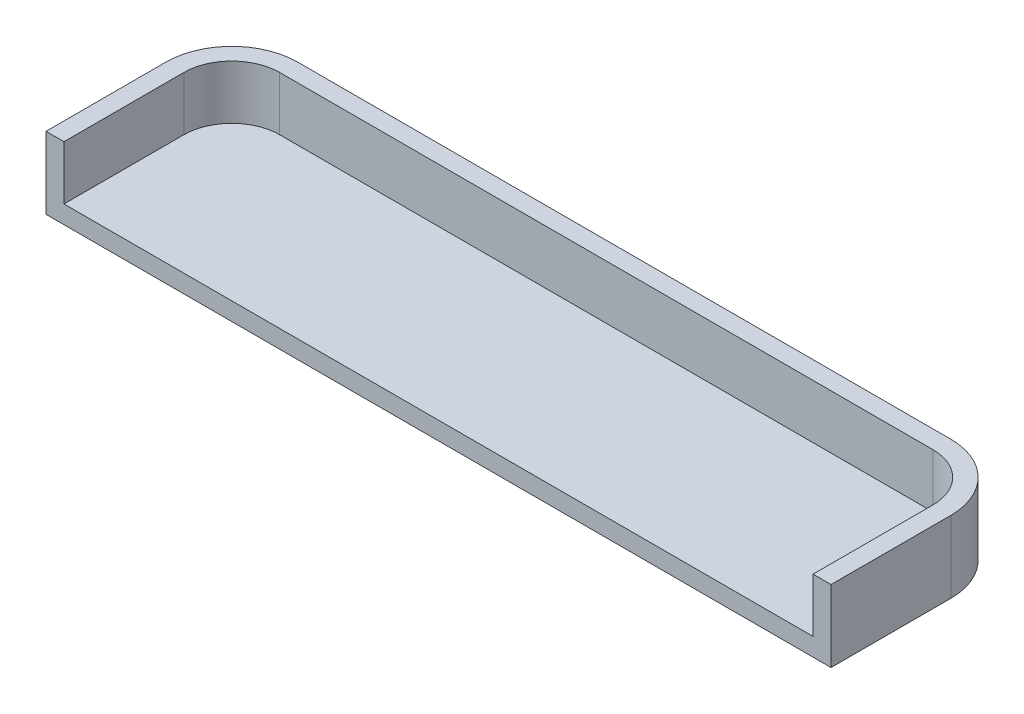
ISO-10303-21;
HEADER;
FILE_DESCRIPTION(('STEP AP214'),'2;1');
FILE_NAME('part.step','',(''),(''),'','','');
FILE_SCHEMA(('AUTOMOTIVE_DESIGN { 1 0 10303 214 1 1 1 1 }'));
ENDSEC;
DATA;
#1=APPLICATION_CONTEXT('core data for automotive mechanical design processes');
#2=APPLICATION_PROTOCOL_DEFINITION('international standard','automotive_design',2000,#1);
#3=PRODUCT_CONTEXT('',#1,'mechanical');
#4=PRODUCT('Part','Part','',(#3));
#5=PRODUCT_RELATED_PRODUCT_CATEGORY('part','',(#4));
#6=PRODUCT_DEFINITION_FORMATION('','',#4);
#7=PRODUCT_DEFINITION_CONTEXT('part definition',#1,'design');
#8=PRODUCT_DEFINITION('design','',#6,#7);
#9=PRODUCT_DEFINITION_SHAPE('','',#8);
#10=(LENGTH_UNIT() NAMED_UNIT(*) SI_UNIT(.MILLI.,.METRE.));
#11=(NAMED_UNIT(*) PLANE_ANGLE_UNIT() SI_UNIT($,.RADIAN.));
#12=(NAMED_UNIT(*) SI_UNIT($,.STERADIAN.) SOLID_ANGLE_UNIT());
#13=UNCERTAINTY_MEASURE_WITH_UNIT(LENGTH_MEASURE(1.E-05),#10,'distance_accuracy_value','');
#14=(GEOMETRIC_REPRESENTATION_CONTEXT(3) GLOBAL_UNCERTAINTY_ASSIGNED_CONTEXT((#13)) GLOBAL_UNIT_ASSIGNED_CONTEXT((#10,
#11,#12)) REPRESENTATION_CONTEXT('',''));
#15=CARTESIAN_POINT('',(0.,0.,0.));
#16=DIRECTION('',(0.,0.,1.));
#17=DIRECTION('',(1.,0.,0.));
#18=AXIS2_PLACEMENT_3D('',#15,#16,#17);
#19=CARTESIAN_POINT('',(0.,12.,11.));
#20=DIRECTION('',(0.,-1.,0.));
#21=DIRECTION('',(0.,0.,-1.));
#22=AXIS2_PLACEMENT_3D('',#19,#20,#21);
#23=CYLINDRICAL_SURFACE('',#22,11.);
#24=CARTESIAN_POINT('',(0.,0.,11.));
#25=DIRECTION('',(0.,1.,0.));
#26=DIRECTION('',(0.,0.,1.));
#27=AXIS2_PLACEMENT_3D('',#24,#25,#26);
#28=CIRCLE('',#27,11.);
#29=CARTESIAN_POINT('',(0.,0.,0.));
#30=VERTEX_POINT('',#29);
#31=CARTESIAN_POINT('',(-11.,0.,11.));
#32=VERTEX_POINT('',#31);
#33=EDGE_CURVE('E134',#30,#32,#28,.T.);
#34=ORIENTED_EDGE('',*,*,#33,.T.);
#35=DIRECTION('',(0.,-1.,0.));
#36=VECTOR('',#35,1.);
#37=CARTESIAN_POINT('',(-11.,12.,11.));
#38=LINE('',#37,#36);
#39=CARTESIAN_POINT('',(-11.,12.,11.));
#40=VERTEX_POINT('',#39);
#41=EDGE_CURVE('E11',#40,#32,#38,.T.);
#42=ORIENTED_EDGE('',*,*,#41,.F.);
#43=CARTESIAN_POINT('',(0.,12.,11.));
#44=DIRECTION('',(0.,1.,0.));
#45=DIRECTION('',(0.,0.,1.));
#46=AXIS2_PLACEMENT_3D('',#43,#44,#45);
#47=CIRCLE('',#46,11.);
#48=CARTESIAN_POINT('',(0.,12.,0.));
#49=VERTEX_POINT('',#48);
#50=EDGE_CURVE('E146',#49,#40,#47,.T.);
#51=ORIENTED_EDGE('',*,*,#50,.F.);
#52=DIRECTION('',(0.,-1.,0.));
#53=VECTOR('',#52,1.);
#54=CARTESIAN_POINT('',(0.,12.,0.));
#55=LINE('',#54,#53);
#56=EDGE_CURVE('E130',#49,#30,#55,.T.);
#57=ORIENTED_EDGE('',*,*,#56,.T.);
#58=EDGE_LOOP('',(#34,#42,#51,#57));
#59=FACE_BOUND('',#58,.T.);
#60=ADVANCED_FACE('F36',(#59),#23,.T.);
#61=CARTESIAN_POINT('',(-11.,12.,11.));
#62=DIRECTION('',(1.,0.,0.));
#63=DIRECTION('',(0.,0.,-1.));
#64=AXIS2_PLACEMENT_3D('',#61,#62,#63);
#65=PLANE('',#64);
#66=DIRECTION('',(0.,0.,1.));
#67=VECTOR('',#66,1.);
#68=CARTESIAN_POINT('',(-11.,0.,11.));
#69=LINE('',#68,#67);
#70=CARTESIAN_POINT('',(-11.,0.,31.));
#71=VERTEX_POINT('',#70);
#72=EDGE_CURVE('E137',#32,#71,#69,.T.);
#73=ORIENTED_EDGE('',*,*,#72,.T.);
#74=DIRECTION('',(0.,-1.,0.));
#75=VECTOR('',#74,1.);
#76=CARTESIAN_POINT('',(-11.,12.,31.));
#77=LINE('',#76,#75);
#78=CARTESIAN_POINT('',(-11.,12.,31.));
#79=VERTEX_POINT('',#78);
#80=EDGE_CURVE('E43',#79,#71,#77,.T.);
#81=ORIENTED_EDGE('',*,*,#80,.F.);
#82=DIRECTION('',(0.,0.,1.));
#83=VECTOR('',#82,1.);
#84=CARTESIAN_POINT('',(-11.,12.,11.));
#85=LINE('',#84,#83);
#86=EDGE_CURVE('E94',#40,#79,#85,.T.);
#87=ORIENTED_EDGE('',*,*,#86,.F.);
#88=ORIENTED_EDGE('',*,*,#41,.T.);
#89=EDGE_LOOP('',(#73,#81,#87,#88));
#90=FACE_BOUND('',#89,.T.);
#91=ADVANCED_FACE('F263',(#90),#65,.F.);
#92=CARTESIAN_POINT('',(-11.,12.,31.));
#93=DIRECTION('',(0.,0.,-1.));
#94=DIRECTION('',(-1.,0.,0.));
#95=AXIS2_PLACEMENT_3D('',#92,#93,#94);
#96=PLANE('',#95);
#97=DIRECTION('',(1.,0.,0.));
#98=VECTOR('',#97,1.);
#99=CARTESIAN_POINT('',(117.,3.,31.));
#100=LINE('',#99,#98);
#101=CARTESIAN_POINT('',(-8.,3.,31.));
#102=VERTEX_POINT('',#101);
#103=CARTESIAN_POINT('',(117.,3.,31.));
#104=VERTEX_POINT('',#103);
#105=EDGE_CURVE('E223',#102,#104,#100,.T.);
#106=ORIENTED_EDGE('',*,*,#105,.F.);
#107=DIRECTION('',(0.,1.,0.));
#108=VECTOR('',#107,1.);
#109=CARTESIAN_POINT('',(-8.,3.,31.));
#110=LINE('',#109,#108);
#111=CARTESIAN_POINT('',(-8.,12.,31.));
#112=VERTEX_POINT('',#111);
#113=EDGE_CURVE('E138',#102,#112,#110,.T.);
#114=ORIENTED_EDGE('',*,*,#113,.T.);
#115=DIRECTION('',(1.,0.,0.));
#116=VECTOR('',#115,1.);
#117=CARTESIAN_POINT('',(-11.,12.,31.));
#118=LINE('',#117,#116);
#119=EDGE_CURVE('E116',#79,#112,#118,.T.);
#120=ORIENTED_EDGE('',*,*,#119,.F.);
#121=ORIENTED_EDGE('',*,*,#80,.T.);
#122=DIRECTION('',(1.,0.,0.));
#123=VECTOR('',#122,1.);
#124=CARTESIAN_POINT('',(-11.,0.,31.));
#125=LINE('',#124,#123);
#126=CARTESIAN_POINT('',(120.,0.,31.));
#127=VERTEX_POINT('',#126);
#128=EDGE_CURVE('E140',#71,#127,#125,.T.);
#129=ORIENTED_EDGE('',*,*,#128,.T.);
#130=DIRECTION('',(0.,-1.,0.));
#131=VECTOR('',#130,1.);
#132=CARTESIAN_POINT('',(120.,12.,31.));
#133=LINE('',#132,#131);
#134=CARTESIAN_POINT('',(120.,12.,31.));
#135=VERTEX_POINT('',#134);
#136=EDGE_CURVE('E125',#135,#127,#133,.T.);
#137=ORIENTED_EDGE('',*,*,#136,.F.);
#138=CARTESIAN_POINT('',(117.,12.,31.));
#139=VERTEX_POINT('',#138);
#140=EDGE_CURVE('E112',#139,#135,#118,.T.);
#141=ORIENTED_EDGE('',*,*,#140,.F.);
#142=DIRECTION('',(0.,1.,0.));
#143=VECTOR('',#142,1.);
#144=CARTESIAN_POINT('',(117.,3.,31.));
#145=LINE('',#144,#143);
#146=EDGE_CURVE('E50',#104,#139,#145,.T.);
#147=ORIENTED_EDGE('',*,*,#146,.F.);
#148=EDGE_LOOP('',(#106,#114,#120,#121,#129,#137,#141,#147));
#149=FACE_BOUND('',#148,.T.);
#150=ADVANCED_FACE('F154',(#149),#96,.F.);
#151=CARTESIAN_POINT('',(120.,12.,11.));
#152=DIRECTION('',(-1.,0.,0.));
#153=DIRECTION('',(0.,0.,1.));
#154=AXIS2_PLACEMENT_3D('',#151,#152,#153);
#155=PLANE('',#154);
#156=DIRECTION('',(0.,0.,-1.));
#157=VECTOR('',#156,1.);
#158=CARTESIAN_POINT('',(120.,0.,11.));
#159=LINE('',#158,#157);
#160=CARTESIAN_POINT('',(120.,0.,11.));
#161=VERTEX_POINT('',#160);
#162=EDGE_CURVE('E122',#127,#161,#159,.T.);
#163=ORIENTED_EDGE('',*,*,#162,.T.);
#164=DIRECTION('',(0.,-1.,0.));
#165=VECTOR('',#164,1.);
#166=CARTESIAN_POINT('',(120.,12.,11.));
#167=LINE('',#166,#165);
#168=CARTESIAN_POINT('',(120.,12.,11.));
#169=VERTEX_POINT('',#168);
#170=EDGE_CURVE('E119',#169,#161,#167,.T.);
#171=ORIENTED_EDGE('',*,*,#170,.F.);
#172=DIRECTION('',(0.,0.,-1.));
#173=VECTOR('',#172,1.);
#174=CARTESIAN_POINT('',(120.,12.,11.));
#175=LINE('',#174,#173);
#176=EDGE_CURVE('E104',#135,#169,#175,.T.);
#177=ORIENTED_EDGE('',*,*,#176,.F.);
#178=ORIENTED_EDGE('',*,*,#136,.T.);
#179=EDGE_LOOP('',(#163,#171,#177,#178));
#180=FACE_BOUND('',#179,.T.);
#181=ADVANCED_FACE('F120',(#180),#155,.F.);
#182=CARTESIAN_POINT('',(109.,12.,11.));
#183=DIRECTION('',(0.,-1.,0.));
#184=DIRECTION('',(0.,0.,-1.));
#185=AXIS2_PLACEMENT_3D('',#182,#183,#184);
#186=CYLINDRICAL_SURFACE('',#185,11.);
#187=CARTESIAN_POINT('',(109.,0.,11.));
#188=DIRECTION('',(0.,1.,0.));
#189=DIRECTION('',(0.,0.,-1.));
#190=AXIS2_PLACEMENT_3D('',#187,#188,#189);
#191=CIRCLE('',#190,11.);
#192=CARTESIAN_POINT('',(109.,0.,0.));
#193=VERTEX_POINT('',#192);
#194=EDGE_CURVE('E143',#161,#193,#191,.T.);
#195=ORIENTED_EDGE('',*,*,#194,.T.);
#196=DIRECTION('',(0.,-1.,0.));
#197=VECTOR('',#196,1.);
#198=CARTESIAN_POINT('',(109.,12.,0.));
#199=LINE('',#198,#197);
#200=CARTESIAN_POINT('',(109.,12.,0.));
#201=VERTEX_POINT('',#200);
#202=EDGE_CURVE('E126',#201,#193,#199,.T.);
#203=ORIENTED_EDGE('',*,*,#202,.F.);
#204=CARTESIAN_POINT('',(109.,12.,11.));
#205=DIRECTION('',(0.,1.,0.));
#206=DIRECTION('',(0.,0.,-1.));
#207=AXIS2_PLACEMENT_3D('',#204,#205,#206);
#208=CIRCLE('',#207,11.);
#209=EDGE_CURVE('E109',#169,#201,#208,.T.);
#210=ORIENTED_EDGE('',*,*,#209,.F.);
#211=ORIENTED_EDGE('',*,*,#170,.T.);
#212=EDGE_LOOP('',(#195,#203,#210,#211));
#213=FACE_BOUND('',#212,.T.);
#214=ADVANCED_FACE('F128',(#213),#186,.T.);
#215=CARTESIAN_POINT('',(0.,12.,0.));
#216=DIRECTION('',(0.,0.,1.));
#217=DIRECTION('',(1.,0.,0.));
#218=AXIS2_PLACEMENT_3D('',#215,#216,#217);
#219=PLANE('',#218);
#220=DIRECTION('',(-1.,0.,0.));
#221=VECTOR('',#220,1.);
#222=CARTESIAN_POINT('',(0.,0.,0.));
#223=LINE('',#222,#221);
#224=EDGE_CURVE('E86',#193,#30,#223,.T.);
#225=ORIENTED_EDGE('',*,*,#224,.T.);
#226=ORIENTED_EDGE('',*,*,#56,.F.);
#227=DIRECTION('',(-1.,0.,0.));
#228=VECTOR('',#227,1.);
#229=CARTESIAN_POINT('',(0.,12.,0.));
#230=LINE('',#229,#228);
#231=EDGE_CURVE('E59',#201,#49,#230,.T.);
#232=ORIENTED_EDGE('',*,*,#231,.F.);
#233=ORIENTED_EDGE('',*,*,#202,.T.);
#234=EDGE_LOOP('',(#225,#226,#232,#233));
#235=FACE_BOUND('',#234,.T.);
#236=ADVANCED_FACE('F160',(#235),#219,.F.);
#237=CARTESIAN_POINT('',(0.,12.,11.));
#238=DIRECTION('',(0.,1.,0.));
#239=DIRECTION('',(0.,0.,1.));
#240=AXIS2_PLACEMENT_3D('',#237,#238,#239);
#241=PLANE('',#240);
#242=DIRECTION('',(0.,0.,1.));
#243=VECTOR('',#242,1.);
#244=CARTESIAN_POINT('',(-8.,12.,31.));
#245=LINE('',#244,#243);
#246=CARTESIAN_POINT('',(-8.,12.,11.));
#247=VERTEX_POINT('',#246);
#248=EDGE_CURVE('E171',#247,#112,#245,.T.);
#249=ORIENTED_EDGE('',*,*,#248,.F.);
#250=CARTESIAN_POINT('',(0.,12.,11.));
#251=DIRECTION('',(0.,1.,0.));
#252=DIRECTION('',(0.,0.,-1.));
#253=AXIS2_PLACEMENT_3D('',#250,#251,#252);
#254=CIRCLE('',#253,8.);
#255=CARTESIAN_POINT('',(0.,12.,3.));
#256=VERTEX_POINT('',#255);
#257=EDGE_CURVE('E239',#256,#247,#254,.T.);
#258=ORIENTED_EDGE('',*,*,#257,.F.);
#259=DIRECTION('',(-1.,0.,0.));
#260=VECTOR('',#259,1.);
#261=CARTESIAN_POINT('',(0.,12.,3.));
#262=LINE('',#261,#260);
#263=CARTESIAN_POINT('',(109.,12.,3.));
#264=VERTEX_POINT('',#263);
#265=EDGE_CURVE('E236',#264,#256,#262,.T.);
#266=ORIENTED_EDGE('',*,*,#265,.F.);
#267=CARTESIAN_POINT('',(109.,12.,11.));
#268=DIRECTION('',(0.,1.,0.));
#269=DIRECTION('',(0.,0.,-1.));
#270=AXIS2_PLACEMENT_3D('',#267,#268,#269);
#271=CIRCLE('',#270,8.);
#272=CARTESIAN_POINT('',(117.,12.,11.));
#273=VERTEX_POINT('',#272);
#274=EDGE_CURVE('E234',#273,#264,#271,.T.);
#275=ORIENTED_EDGE('',*,*,#274,.F.);
#276=DIRECTION('',(0.,0.,-1.));
#277=VECTOR('',#276,1.);
#278=CARTESIAN_POINT('',(117.,12.,11.));
#279=LINE('',#278,#277);
#280=EDGE_CURVE('E208',#139,#273,#279,.T.);
#281=ORIENTED_EDGE('',*,*,#280,.F.);
#282=ORIENTED_EDGE('',*,*,#140,.T.);
#283=ORIENTED_EDGE('',*,*,#176,.T.);
#284=ORIENTED_EDGE('',*,*,#209,.T.);
#285=ORIENTED_EDGE('',*,*,#231,.T.);
#286=ORIENTED_EDGE('',*,*,#50,.T.);
#287=ORIENTED_EDGE('',*,*,#86,.T.);
#288=ORIENTED_EDGE('',*,*,#119,.T.);
#289=EDGE_LOOP('',(#249,#258,#266,#275,#281,#282,#283,#284,#285,#286,#287,#288));
#290=FACE_BOUND('',#289,.T.);
#291=ADVANCED_FACE('F107',(#290),#241,.T.);
#292=CARTESIAN_POINT('',(0.,0.,11.));
#293=DIRECTION('',(0.,1.,0.));
#294=DIRECTION('',(0.,0.,1.));
#295=AXIS2_PLACEMENT_3D('',#292,#293,#294);
#296=PLANE('',#295);
#297=ORIENTED_EDGE('',*,*,#33,.F.);
#298=ORIENTED_EDGE('',*,*,#224,.F.);
#299=ORIENTED_EDGE('',*,*,#194,.F.);
#300=ORIENTED_EDGE('',*,*,#162,.F.);
#301=ORIENTED_EDGE('',*,*,#128,.F.);
#302=ORIENTED_EDGE('',*,*,#72,.F.);
#303=EDGE_LOOP('',(#297,#298,#299,#300,#301,#302));
#304=FACE_BOUND('',#303,.T.);
#305=ADVANCED_FACE('F159',(#304),#296,.F.);
#306=CARTESIAN_POINT('',(-8.,3.,31.));
#307=DIRECTION('',(-1.,0.,0.));
#308=DIRECTION('',(0.,0.,1.));
#309=AXIS2_PLACEMENT_3D('',#306,#307,#308);
#310=PLANE('',#309);
#311=ORIENTED_EDGE('',*,*,#248,.T.);
#312=ORIENTED_EDGE('',*,*,#113,.F.);
#313=DIRECTION('',(0.,0.,1.));
#314=VECTOR('',#313,1.);
#315=CARTESIAN_POINT('',(-8.,3.,31.));
#316=LINE('',#315,#314);
#317=CARTESIAN_POINT('',(-8.,3.,11.));
#318=VERTEX_POINT('',#317);
#319=EDGE_CURVE('E231',#318,#102,#316,.T.);
#320=ORIENTED_EDGE('',*,*,#319,.F.);
#321=DIRECTION('',(0.,1.,0.));
#322=VECTOR('',#321,1.);
#323=CARTESIAN_POINT('',(-8.,3.,11.));
#324=LINE('',#323,#322);
#325=EDGE_CURVE('E181',#318,#247,#324,.T.);
#326=ORIENTED_EDGE('',*,*,#325,.T.);
#327=EDGE_LOOP('',(#311,#312,#320,#326));
#328=FACE_BOUND('',#327,.T.);
#329=ADVANCED_FACE('F252',(#328),#310,.F.);
#330=CARTESIAN_POINT('',(0.,3.,11.));
#331=DIRECTION('',(0.,1.,0.));
#332=DIRECTION('',(0.,0.,1.));
#333=AXIS2_PLACEMENT_3D('',#330,#331,#332);
#334=CYLINDRICAL_SURFACE('',#333,8.);
#335=ORIENTED_EDGE('',*,*,#257,.T.);
#336=ORIENTED_EDGE('',*,*,#325,.F.);
#337=CARTESIAN_POINT('',(0.,3.,11.));
#338=DIRECTION('',(0.,1.,0.));
#339=DIRECTION('',(0.,0.,-1.));
#340=AXIS2_PLACEMENT_3D('',#337,#338,#339);
#341=CIRCLE('',#340,8.);
#342=CARTESIAN_POINT('',(0.,3.,3.));
#343=VERTEX_POINT('',#342);
#344=EDGE_CURVE('E228',#343,#318,#341,.T.);
#345=ORIENTED_EDGE('',*,*,#344,.F.);
#346=DIRECTION('',(0.,1.,0.));
#347=VECTOR('',#346,1.);
#348=CARTESIAN_POINT('',(0.,3.,3.));
#349=LINE('',#348,#347);
#350=EDGE_CURVE('E244',#343,#256,#349,.T.);
#351=ORIENTED_EDGE('',*,*,#350,.T.);
#352=EDGE_LOOP('',(#335,#336,#345,#351));
#353=FACE_BOUND('',#352,.T.);
#354=ADVANCED_FACE('F250',(#353),#334,.F.);
#355=CARTESIAN_POINT('',(0.,3.,3.));
#356=DIRECTION('',(0.,0.,-1.));
#357=DIRECTION('',(-1.,0.,0.));
#358=AXIS2_PLACEMENT_3D('',#355,#356,#357);
#359=PLANE('',#358);
#360=ORIENTED_EDGE('',*,*,#265,.T.);
#361=ORIENTED_EDGE('',*,*,#350,.F.);
#362=DIRECTION('',(-1.,0.,0.));
#363=VECTOR('',#362,1.);
#364=CARTESIAN_POINT('',(0.,3.,3.));
#365=LINE('',#364,#363);
#366=CARTESIAN_POINT('',(109.,3.,3.));
#367=VERTEX_POINT('',#366);
#368=EDGE_CURVE('E219',#367,#343,#365,.T.);
#369=ORIENTED_EDGE('',*,*,#368,.F.);
#370=DIRECTION('',(0.,1.,0.));
#371=VECTOR('',#370,1.);
#372=CARTESIAN_POINT('',(109.,3.,3.));
#373=LINE('',#372,#371);
#374=EDGE_CURVE('E212',#367,#264,#373,.T.);
#375=ORIENTED_EDGE('',*,*,#374,.T.);
#376=EDGE_LOOP('',(#360,#361,#369,#375));
#377=FACE_BOUND('',#376,.T.);
#378=ADVANCED_FACE('F247',(#377),#359,.F.);
#379=CARTESIAN_POINT('',(109.,3.,11.));
#380=DIRECTION('',(0.,1.,0.));
#381=DIRECTION('',(0.,0.,1.));
#382=AXIS2_PLACEMENT_3D('',#379,#380,#381);
#383=CYLINDRICAL_SURFACE('',#382,8.);
#384=ORIENTED_EDGE('',*,*,#274,.T.);
#385=ORIENTED_EDGE('',*,*,#374,.F.);
#386=CARTESIAN_POINT('',(109.,3.,11.));
#387=DIRECTION('',(0.,1.,0.));
#388=DIRECTION('',(0.,0.,-1.));
#389=AXIS2_PLACEMENT_3D('',#386,#387,#388);
#390=CIRCLE('',#389,8.);
#391=CARTESIAN_POINT('',(117.,3.,11.));
#392=VERTEX_POINT('',#391);
#393=EDGE_CURVE('E214',#392,#367,#390,.T.);
#394=ORIENTED_EDGE('',*,*,#393,.F.);
#395=DIRECTION('',(0.,1.,0.));
#396=VECTOR('',#395,1.);
#397=CARTESIAN_POINT('',(117.,3.,11.));
#398=LINE('',#397,#396);
#399=EDGE_CURVE('E202',#392,#273,#398,.T.);
#400=ORIENTED_EDGE('',*,*,#399,.T.);
#401=EDGE_LOOP('',(#384,#385,#394,#400));
#402=FACE_BOUND('',#401,.T.);
#403=ADVANCED_FACE('F215',(#402),#383,.F.);
#404=CARTESIAN_POINT('',(117.,3.,11.));
#405=DIRECTION('',(1.,0.,0.));
#406=DIRECTION('',(0.,0.,-1.));
#407=AXIS2_PLACEMENT_3D('',#404,#405,#406);
#408=PLANE('',#407);
#409=ORIENTED_EDGE('',*,*,#280,.T.);
#410=ORIENTED_EDGE('',*,*,#399,.F.);
#411=DIRECTION('',(0.,0.,-1.));
#412=VECTOR('',#411,1.);
#413=CARTESIAN_POINT('',(117.,3.,11.));
#414=LINE('',#413,#412);
#415=EDGE_CURVE('E206',#104,#392,#414,.T.);
#416=ORIENTED_EDGE('',*,*,#415,.F.);
#417=ORIENTED_EDGE('',*,*,#146,.T.);
#418=EDGE_LOOP('',(#409,#410,#416,#417));
#419=FACE_BOUND('',#418,.T.);
#420=ADVANCED_FACE('F204',(#419),#408,.F.);
#421=CARTESIAN_POINT('',(0.,3.,11.));
#422=DIRECTION('',(0.,-1.,0.));
#423=DIRECTION('',(0.,0.,-1.));
#424=AXIS2_PLACEMENT_3D('',#421,#422,#423);
#425=PLANE('',#424);
#426=ORIENTED_EDGE('',*,*,#105,.T.);
#427=ORIENTED_EDGE('',*,*,#415,.T.);
#428=ORIENTED_EDGE('',*,*,#393,.T.);
#429=ORIENTED_EDGE('',*,*,#368,.T.);
#430=ORIENTED_EDGE('',*,*,#344,.T.);
#431=ORIENTED_EDGE('',*,*,#319,.T.);
#432=EDGE_LOOP('',(#426,#427,#428,#429,#430,#431));
#433=FACE_BOUND('',#432,.T.);
#434=ADVANCED_FACE('F221',(#433),#425,.F.);
#435=CLOSED_SHELL('',(#60,#91,#150,#181,#214,#236,#291,#305,#329,#354,#378,#403,#420,#434));
#436=MANIFOLD_SOLID_BREP('B2',#435);
#437=ADVANCED_BREP_SHAPE_REPRESENTATION('',(#18,#436),#14);
#438=SHAPE_DEFINITION_REPRESENTATION(#9,#437);
ENDSEC;
END-ISO-10303-21;
